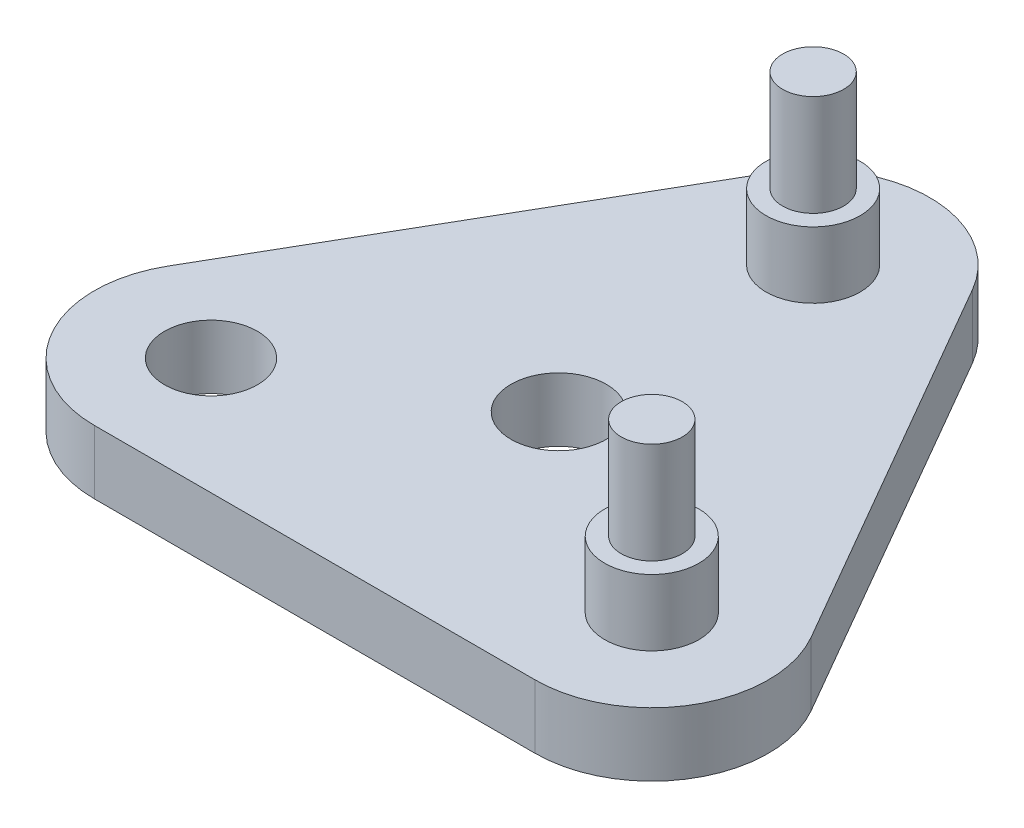
ISO-10303-21;
HEADER;
FILE_DESCRIPTION(('STEP AP214'),'2;1');
FILE_NAME('part.step','',(''),(''),'','','');
FILE_SCHEMA(('AUTOMOTIVE_DESIGN { 1 0 10303 214 1 1 1 1 }'));
ENDSEC;
DATA;
#1=APPLICATION_CONTEXT('core data for automotive mechanical design processes');
#2=APPLICATION_PROTOCOL_DEFINITION('international standard','automotive_design',2000,#1);
#3=PRODUCT_CONTEXT('',#1,'mechanical');
#4=PRODUCT('Part','Part','',(#3));
#5=PRODUCT_RELATED_PRODUCT_CATEGORY('part','',(#4));
#6=PRODUCT_DEFINITION_FORMATION('','',#4);
#7=PRODUCT_DEFINITION_CONTEXT('part definition',#1,'design');
#8=PRODUCT_DEFINITION('design','',#6,#7);
#9=PRODUCT_DEFINITION_SHAPE('','',#8);
#10=(LENGTH_UNIT() NAMED_UNIT(*) SI_UNIT(.MILLI.,.METRE.));
#11=(NAMED_UNIT(*) PLANE_ANGLE_UNIT() SI_UNIT($,.RADIAN.));
#12=(NAMED_UNIT(*) SI_UNIT($,.STERADIAN.) SOLID_ANGLE_UNIT());
#13=UNCERTAINTY_MEASURE_WITH_UNIT(LENGTH_MEASURE(1.E-05),#10,'distance_accuracy_value','');
#14=(GEOMETRIC_REPRESENTATION_CONTEXT(3) GLOBAL_UNCERTAINTY_ASSIGNED_CONTEXT((#13)) GLOBAL_UNIT_ASSIGNED_CONTEXT((#10,
#11,#12)) REPRESENTATION_CONTEXT('',''));
#15=CARTESIAN_POINT('',(0.,0.,0.));
#16=DIRECTION('',(0.,0.,1.));
#17=DIRECTION('',(1.,0.,0.));
#18=AXIS2_PLACEMENT_3D('',#15,#16,#17);
#19=CARTESIAN_POINT('',(-157.085204837098,-236.847084493501,-327.210425190433));
#20=DIRECTION('',(0.866025403784439,0.,0.5));
#21=DIRECTION('',(0.,-1.,0.));
#22=AXIS2_PLACEMENT_3D('',#19,#20,#21);
#23=PLANE('',#22);
#24=DIRECTION('',(-0.5,0.,0.866025403784439));
#25=VECTOR('',#24,1.);
#26=CARTESIAN_POINT('',(-135.088159580973,-243.197084493501,-365.310425190433));
#27=LINE('',#26,#25);
#28=CARTESIAN_POINT('',(-135.088159580973,-243.197084493501,-365.310425190433));
#29=VERTEX_POINT('',#28);
#30=CARTESIAN_POINT('',(-157.085204837098,-243.197084493501,-327.210425190433));
#31=VERTEX_POINT('',#30);
#32=EDGE_CURVE('E129',#29,#31,#27,.T.);
#33=ORIENTED_EDGE('',*,*,#32,.T.);
#34=DIRECTION('',(0.,-1.,0.));
#35=VECTOR('',#34,1.);
#36=CARTESIAN_POINT('',(-157.085204837098,-236.847084493501,-327.210425190433));
#37=LINE('',#36,#35);
#38=CARTESIAN_POINT('',(-157.085204837098,-236.847084493501,-327.210425190433));
#39=VERTEX_POINT('',#38);
#40=EDGE_CURVE('E164',#39,#31,#37,.T.);
#41=ORIENTED_EDGE('',*,*,#40,.F.);
#42=DIRECTION('',(-0.5,0.,0.866025403784439));
#43=VECTOR('',#42,1.);
#44=CARTESIAN_POINT('',(-135.088159580973,-236.847084493501,-365.310425190433));
#45=LINE('',#44,#43);
#46=CARTESIAN_POINT('',(-135.088159580973,-236.847084493501,-365.310425190433));
#47=VERTEX_POINT('',#46);
#48=EDGE_CURVE('E132',#47,#39,#45,.T.);
#49=ORIENTED_EDGE('',*,*,#48,.F.);
#50=DIRECTION('',(0.,-1.,0.));
#51=VECTOR('',#50,1.);
#52=CARTESIAN_POINT('',(-135.088159580973,-236.847084493501,-365.310425190433));
#53=LINE('',#52,#51);
#54=EDGE_CURVE('E12',#47,#29,#53,.T.);
#55=ORIENTED_EDGE('',*,*,#54,.T.);
#56=EDGE_LOOP('',(#33,#41,#49,#55));
#57=FACE_BOUND('',#56,.T.);
#58=ADVANCED_FACE('F65',(#57),#23,.F.);
#59=CARTESIAN_POINT('',(-125.00251433104,-236.847084493501,-359.487475190433));
#60=DIRECTION('',(0.,-1.,0.));
#61=DIRECTION('',(-1.,0.,0.));
#62=AXIS2_PLACEMENT_3D('',#59,#60,#61);
#63=CYLINDRICAL_SURFACE('',#62,11.6459);
#64=CARTESIAN_POINT('',(-125.00251433104,-243.197084493501,-359.487475190433));
#65=DIRECTION('',(0.,1.,0.));
#66=DIRECTION('',(1.,0.,0.));
#67=AXIS2_PLACEMENT_3D('',#64,#65,#66);
#68=CIRCLE('',#67,11.6459);
#69=CARTESIAN_POINT('',(-114.916869081106,-243.197084493501,-365.310425190433));
#70=VERTEX_POINT('',#69);
#71=EDGE_CURVE('E137',#70,#29,#68,.T.);
#72=ORIENTED_EDGE('',*,*,#71,.T.);
#73=ORIENTED_EDGE('',*,*,#54,.F.);
#74=CARTESIAN_POINT('',(-125.00251433104,-236.847084493501,-359.487475190433));
#75=DIRECTION('',(0.,1.,0.));
#76=DIRECTION('',(1.,0.,0.));
#77=AXIS2_PLACEMENT_3D('',#74,#75,#76);
#78=CIRCLE('',#77,11.6459);
#79=CARTESIAN_POINT('',(-114.916869081106,-236.847084493501,-365.310425190433));
#80=VERTEX_POINT('',#79);
#81=EDGE_CURVE('E188',#80,#47,#78,.T.);
#82=ORIENTED_EDGE('',*,*,#81,.F.);
#83=DIRECTION('',(0.,-1.,0.));
#84=VECTOR('',#83,1.);
#85=CARTESIAN_POINT('',(-114.916869081106,-236.847084493501,-365.310425190433));
#86=LINE('',#85,#84);
#87=EDGE_CURVE('E76',#80,#70,#86,.T.);
#88=ORIENTED_EDGE('',*,*,#87,.T.);
#89=EDGE_LOOP('',(#72,#73,#82,#88));
#90=FACE_BOUND('',#89,.T.);
#91=ADVANCED_FACE('F138',(#90),#63,.T.);
#92=CARTESIAN_POINT('',(-114.916869081106,-236.847084493501,-365.310425190433));
#93=DIRECTION('',(-0.866025403784438,0.,0.5));
#94=DIRECTION('',(-0.5,0.,-0.866025403784438));
#95=AXIS2_PLACEMENT_3D('',#92,#93,#94);
#96=PLANE('',#95);
#97=DIRECTION('',(-0.5,0.,-0.866025403784438));
#98=VECTOR('',#97,1.);
#99=CARTESIAN_POINT('',(-92.9198238249817,-243.197084493501,-327.210425190433));
#100=LINE('',#99,#98);
#101=CARTESIAN_POINT('',(-92.9198238249817,-243.197084493501,-327.210425190433));
#102=VERTEX_POINT('',#101);
#103=EDGE_CURVE('E143',#102,#70,#100,.T.);
#104=ORIENTED_EDGE('',*,*,#103,.T.);
#105=ORIENTED_EDGE('',*,*,#87,.F.);
#106=DIRECTION('',(-0.5,0.,-0.866025403784438));
#107=VECTOR('',#106,1.);
#108=CARTESIAN_POINT('',(-92.9198238249817,-236.847084493501,-327.210425190433));
#109=LINE('',#108,#107);
#110=CARTESIAN_POINT('',(-92.9198238249817,-236.847084493501,-327.210425190433));
#111=VERTEX_POINT('',#110);
#112=EDGE_CURVE('E186',#111,#80,#109,.T.);
#113=ORIENTED_EDGE('',*,*,#112,.F.);
#114=DIRECTION('',(0.,-1.,0.));
#115=VECTOR('',#114,1.);
#116=CARTESIAN_POINT('',(-92.9198238249817,-236.847084493501,-327.210425190433));
#117=LINE('',#116,#115);
#118=EDGE_CURVE('E171',#111,#102,#117,.T.);
#119=ORIENTED_EDGE('',*,*,#118,.T.);
#120=EDGE_LOOP('',(#104,#105,#113,#119));
#121=FACE_BOUND('',#120,.T.);
#122=ADVANCED_FACE('F67',(#121),#96,.F.);
#123=CARTESIAN_POINT('',(-103.005469074915,-236.847084493501,-321.387475190433));
#124=DIRECTION('',(0.,-1.,0.));
#125=DIRECTION('',(0.866025403784439,0.,0.5));
#126=AXIS2_PLACEMENT_3D('',#123,#124,#125);
#127=CYLINDRICAL_SURFACE('',#126,11.6459);
#128=CARTESIAN_POINT('',(-103.005469074915,-243.197084493501,-321.387475190433));
#129=DIRECTION('',(0.,1.,0.));
#130=DIRECTION('',(1.,0.,0.));
#131=AXIS2_PLACEMENT_3D('',#128,#129,#130);
#132=CIRCLE('',#131,11.6459);
#133=CARTESIAN_POINT('',(-103.005469074915,-243.197084493501,-309.741575190433));
#134=VERTEX_POINT('',#133);
#135=EDGE_CURVE('E158',#134,#102,#132,.T.);
#136=ORIENTED_EDGE('',*,*,#135,.T.);
#137=ORIENTED_EDGE('',*,*,#118,.F.);
#138=CARTESIAN_POINT('',(-103.005469074915,-236.847084493501,-321.387475190433));
#139=DIRECTION('',(0.,1.,0.));
#140=DIRECTION('',(1.,0.,0.));
#141=AXIS2_PLACEMENT_3D('',#138,#139,#140);
#142=CIRCLE('',#141,11.6459);
#143=CARTESIAN_POINT('',(-103.005469074915,-236.847084493501,-309.741575190433));
#144=VERTEX_POINT('',#143);
#145=EDGE_CURVE('E184',#144,#111,#142,.T.);
#146=ORIENTED_EDGE('',*,*,#145,.F.);
#147=DIRECTION('',(0.,-1.,0.));
#148=VECTOR('',#147,1.);
#149=CARTESIAN_POINT('',(-103.005469074915,-236.847084493501,-309.741575190433));
#150=LINE('',#149,#148);
#151=EDGE_CURVE('E88',#144,#134,#150,.T.);
#152=ORIENTED_EDGE('',*,*,#151,.T.);
#153=EDGE_LOOP('',(#136,#137,#146,#152));
#154=FACE_BOUND('',#153,.T.);
#155=ADVANCED_FACE('F273',(#154),#127,.T.);
#156=CARTESIAN_POINT('',(-146.999559587164,-236.847084493501,-309.741575190433));
#157=DIRECTION('',(0.,0.,-1.));
#158=DIRECTION('',(1.,0.,0.));
#159=AXIS2_PLACEMENT_3D('',#156,#157,#158);
#160=PLANE('',#159);
#161=DIRECTION('',(1.,0.,0.));
#162=VECTOR('',#161,1.);
#163=CARTESIAN_POINT('',(-146.999559587164,-243.197084493501,-309.741575190433));
#164=LINE('',#163,#162);
#165=CARTESIAN_POINT('',(-146.999559587164,-243.197084493501,-309.741575190433));
#166=VERTEX_POINT('',#165);
#167=EDGE_CURVE('E161',#166,#134,#164,.T.);
#168=ORIENTED_EDGE('',*,*,#167,.T.);
#169=ORIENTED_EDGE('',*,*,#151,.F.);
#170=DIRECTION('',(1.,0.,0.));
#171=VECTOR('',#170,1.);
#172=CARTESIAN_POINT('',(-146.999559587164,-236.847084493501,-309.741575190433));
#173=LINE('',#172,#171);
#174=CARTESIAN_POINT('',(-146.999559587164,-236.847084493501,-309.741575190433));
#175=VERTEX_POINT('',#174);
#176=EDGE_CURVE('E198',#175,#144,#173,.T.);
#177=ORIENTED_EDGE('',*,*,#176,.F.);
#178=DIRECTION('',(0.,-1.,0.));
#179=VECTOR('',#178,1.);
#180=CARTESIAN_POINT('',(-146.999559587164,-236.847084493501,-309.741575190433));
#181=LINE('',#180,#179);
#182=EDGE_CURVE('E119',#175,#166,#181,.T.);
#183=ORIENTED_EDGE('',*,*,#182,.T.);
#184=EDGE_LOOP('',(#168,#169,#177,#183));
#185=FACE_BOUND('',#184,.T.);
#186=ADVANCED_FACE('F275',(#185),#160,.F.);
#187=CARTESIAN_POINT('',(-146.999559587164,-236.847084493501,-321.387475190433));
#188=DIRECTION('',(0.,-1.,0.));
#189=DIRECTION('',(-1.,0.,0.));
#190=AXIS2_PLACEMENT_3D('',#187,#188,#189);
#191=CYLINDRICAL_SURFACE('',#190,11.6459);
#192=CARTESIAN_POINT('',(-146.999559587164,-243.197084493501,-321.387475190433));
#193=DIRECTION('',(0.,1.,0.));
#194=DIRECTION('',(1.,0.,0.));
#195=AXIS2_PLACEMENT_3D('',#192,#193,#194);
#196=CIRCLE('',#195,11.6459);
#197=EDGE_CURVE('E147',#31,#166,#196,.T.);
#198=ORIENTED_EDGE('',*,*,#197,.T.);
#199=ORIENTED_EDGE('',*,*,#182,.F.);
#200=CARTESIAN_POINT('',(-146.999559587164,-236.847084493501,-321.387475190433));
#201=DIRECTION('',(0.,1.,0.));
#202=DIRECTION('',(1.,0.,0.));
#203=AXIS2_PLACEMENT_3D('',#200,#201,#202);
#204=CIRCLE('',#203,11.6459);
#205=EDGE_CURVE('E202',#39,#175,#204,.T.);
#206=ORIENTED_EDGE('',*,*,#205,.F.);
#207=ORIENTED_EDGE('',*,*,#40,.T.);
#208=EDGE_LOOP('',(#198,#199,#206,#207));
#209=FACE_BOUND('',#208,.T.);
#210=ADVANCED_FACE('F277',(#209),#191,.T.);
#211=CARTESIAN_POINT('',(-146.999559587164,-243.197084493501,-321.387475190433));
#212=DIRECTION('',(0.,1.,0.));
#213=DIRECTION('',(1.,0.,0.));
#214=AXIS2_PLACEMENT_3D('',#211,#212,#213);
#215=PLANE('',#214);
#216=CARTESIAN_POINT('',(-146.999559587164,-243.197084493501,-321.387475190433));
#217=DIRECTION('',(0.,1.,0.));
#218=DIRECTION('',(-1.,0.,0.));
#219=AXIS2_PLACEMENT_3D('',#216,#217,#218);
#220=CIRCLE('',#219,4.6355);
#221=CARTESIAN_POINT('',(-151.635059587164,-243.197084493501,-321.387475190433));
#222=VERTEX_POINT('',#221);
#223=EDGE_CURVE('E204',#222,#222,#220,.T.);
#224=ORIENTED_EDGE('',*,*,#223,.T.);
#225=EDGE_LOOP('',(#224));
#226=FACE_BOUND('',#225,.T.);
#227=CARTESIAN_POINT('',(-125.00251433104,-243.197084493501,-334.087475190433));
#228=DIRECTION('',(0.,1.,0.));
#229=DIRECTION('',(-1.,0.,0.));
#230=AXIS2_PLACEMENT_3D('',#227,#228,#229);
#231=CIRCLE('',#230,4.7625);
#232=CARTESIAN_POINT('',(-129.76501433104,-243.197084493501,-334.087475190433));
#233=VERTEX_POINT('',#232);
#234=EDGE_CURVE('E212',#233,#233,#231,.T.);
#235=ORIENTED_EDGE('',*,*,#234,.T.);
#236=EDGE_LOOP('',(#235));
#237=FACE_BOUND('',#236,.T.);
#238=ORIENTED_EDGE('',*,*,#197,.F.);
#239=ORIENTED_EDGE('',*,*,#32,.F.);
#240=ORIENTED_EDGE('',*,*,#71,.F.);
#241=ORIENTED_EDGE('',*,*,#103,.F.);
#242=ORIENTED_EDGE('',*,*,#135,.F.);
#243=ORIENTED_EDGE('',*,*,#167,.F.);
#244=EDGE_LOOP('',(#238,#239,#240,#241,#242,#243));
#245=FACE_BOUND('',#244,.T.);
#246=ADVANCED_FACE('F145',(#226,#237,#245),#215,.F.);
#247=CARTESIAN_POINT('',(-146.999559587164,-236.847084493501,-321.387475190433));
#248=DIRECTION('',(0.,1.,0.));
#249=DIRECTION('',(1.,0.,0.));
#250=AXIS2_PLACEMENT_3D('',#247,#248,#249);
#251=PLANE('',#250);
#252=CARTESIAN_POINT('',(-125.00251433104,-236.847084493501,-359.487475190433));
#253=DIRECTION('',(0.,1.,0.));
#254=DIRECTION('',(-1.,0.,0.));
#255=AXIS2_PLACEMENT_3D('',#252,#253,#254);
#256=CIRCLE('',#255,4.699);
#257=CARTESIAN_POINT('',(-120.30351433104,-236.847084493501,-359.487475190433));
#258=VERTEX_POINT('',#257);
#259=EDGE_CURVE('E224',#258,#258,#256,.T.);
#260=ORIENTED_EDGE('',*,*,#259,.F.);
#261=EDGE_LOOP('',(#260));
#262=FACE_BOUND('',#261,.T.);
#263=CARTESIAN_POINT('',(-103.005469074915,-236.847084493501,-321.387475190433));
#264=DIRECTION('',(0.,1.,0.));
#265=DIRECTION('',(-1.,0.,0.));
#266=AXIS2_PLACEMENT_3D('',#263,#264,#265);
#267=CIRCLE('',#266,4.699);
#268=CARTESIAN_POINT('',(-98.3064690749149,-236.847084493501,-321.387475190433));
#269=VERTEX_POINT('',#268);
#270=EDGE_CURVE('E219',#269,#269,#267,.T.);
#271=ORIENTED_EDGE('',*,*,#270,.F.);
#272=EDGE_LOOP('',(#271));
#273=FACE_BOUND('',#272,.T.);
#274=CARTESIAN_POINT('',(-125.00251433104,-236.847084493501,-334.087475190433));
#275=DIRECTION('',(0.,1.,0.));
#276=DIRECTION('',(-1.,0.,0.));
#277=AXIS2_PLACEMENT_3D('',#274,#275,#276);
#278=CIRCLE('',#277,4.7625);
#279=CARTESIAN_POINT('',(-129.76501433104,-236.847084493501,-334.087475190433));
#280=VERTEX_POINT('',#279);
#281=EDGE_CURVE('E69',#280,#280,#278,.T.);
#282=ORIENTED_EDGE('',*,*,#281,.F.);
#283=EDGE_LOOP('',(#282));
#284=FACE_BOUND('',#283,.T.);
#285=CARTESIAN_POINT('',(-146.999559587164,-236.847084493501,-321.387475190433));
#286=DIRECTION('',(0.,1.,0.));
#287=DIRECTION('',(-1.,0.,0.));
#288=AXIS2_PLACEMENT_3D('',#285,#286,#287);
#289=CIRCLE('',#288,4.6355);
#290=CARTESIAN_POINT('',(-151.635059587164,-236.847084493501,-321.387475190433));
#291=VERTEX_POINT('',#290);
#292=EDGE_CURVE('E208',#291,#291,#289,.T.);
#293=ORIENTED_EDGE('',*,*,#292,.F.);
#294=EDGE_LOOP('',(#293));
#295=FACE_BOUND('',#294,.T.);
#296=ORIENTED_EDGE('',*,*,#205,.T.);
#297=ORIENTED_EDGE('',*,*,#176,.T.);
#298=ORIENTED_EDGE('',*,*,#145,.T.);
#299=ORIENTED_EDGE('',*,*,#112,.T.);
#300=ORIENTED_EDGE('',*,*,#81,.T.);
#301=ORIENTED_EDGE('',*,*,#48,.T.);
#302=EDGE_LOOP('',(#296,#297,#298,#299,#300,#301));
#303=FACE_BOUND('',#302,.T.);
#304=ADVANCED_FACE('F283',(#262,#273,#284,#295,#303),#251,.T.);
#305=CARTESIAN_POINT('',(-125.00251433104,-249.547084493501,-334.087475190433));
#306=DIRECTION('',(0.,1.,0.));
#307=DIRECTION('',(-1.,0.,0.));
#308=AXIS2_PLACEMENT_3D('',#305,#306,#307);
#309=CYLINDRICAL_SURFACE('',#308,4.7625);
#310=ORIENTED_EDGE('',*,*,#281,.T.);
#311=EDGE_LOOP('',(#310));
#312=FACE_BOUND('',#311,.T.);
#313=ORIENTED_EDGE('',*,*,#234,.F.);
#314=EDGE_LOOP('',(#313));
#315=FACE_BOUND('',#314,.T.);
#316=ADVANCED_FACE('F288',(#312,#315),#309,.F.);
#317=CARTESIAN_POINT('',(-146.999559587164,-249.547084493501,-321.387475190433));
#318=DIRECTION('',(0.,1.,0.));
#319=DIRECTION('',(-1.,0.,0.));
#320=AXIS2_PLACEMENT_3D('',#317,#318,#319);
#321=CYLINDRICAL_SURFACE('',#320,4.6355);
#322=ORIENTED_EDGE('',*,*,#292,.T.);
#323=EDGE_LOOP('',(#322));
#324=FACE_BOUND('',#323,.T.);
#325=ORIENTED_EDGE('',*,*,#223,.F.);
#326=EDGE_LOOP('',(#325));
#327=FACE_BOUND('',#326,.T.);
#328=ADVANCED_FACE('F292',(#324,#327),#321,.F.);
#329=CARTESIAN_POINT('',(-125.00251433104,-230.243084493501,-359.487475190433));
#330=DIRECTION('',(0.,-1.,0.));
#331=DIRECTION('',(1.,0.,0.));
#332=AXIS2_PLACEMENT_3D('',#329,#330,#331);
#333=CYLINDRICAL_SURFACE('',#332,4.699);
#334=CARTESIAN_POINT('',(-125.00251433104,-230.243084493501,-359.487475190433));
#335=DIRECTION('',(0.,1.,0.));
#336=DIRECTION('',(-1.,0.,0.));
#337=AXIS2_PLACEMENT_3D('',#334,#335,#336);
#338=CIRCLE('',#337,4.699);
#339=CARTESIAN_POINT('',(-120.30351433104,-230.243084493501,-359.487475190433));
#340=VERTEX_POINT('',#339);
#341=EDGE_CURVE('E228',#340,#340,#338,.T.);
#342=CARTESIAN_POINT('',(-120.30351433104,-230.243084493501,-359.487475190433));
#343=CARTESIAN_POINT('',(-120.30351433104,-230.311876160168,-359.487475190433));
#344=CARTESIAN_POINT('',(-120.30351433104,-230.380667826834,-359.487475190433));
#345=CARTESIAN_POINT('',(-120.30351433104,-230.518251160168,-359.487475190433));
#346=CARTESIAN_POINT('',(-120.30351433104,-230.587042826834,-359.487475190433));
#347=CARTESIAN_POINT('',(-120.30351433104,-230.724626160168,-359.487475190433));
#348=CARTESIAN_POINT('',(-120.30351433104,-230.793417826834,-359.487475190433));
#349=CARTESIAN_POINT('',(-120.30351433104,-230.931001160168,-359.487475190433));
#350=CARTESIAN_POINT('',(-120.30351433104,-230.999792826834,-359.487475190433));
#351=CARTESIAN_POINT('',(-120.30351433104,-231.137376160168,-359.487475190433));
#352=CARTESIAN_POINT('',(-120.30351433104,-231.206167826834,-359.487475190433));
#353=CARTESIAN_POINT('',(-120.30351433104,-231.343751160168,-359.487475190433));
#354=CARTESIAN_POINT('',(-120.30351433104,-231.412542826834,-359.487475190433));
#355=CARTESIAN_POINT('',(-120.30351433104,-231.550126160168,-359.487475190433));
#356=CARTESIAN_POINT('',(-120.30351433104,-231.618917826834,-359.487475190433));
#357=CARTESIAN_POINT('',(-120.30351433104,-231.756501160168,-359.487475190433));
#358=CARTESIAN_POINT('',(-120.30351433104,-231.825292826834,-359.487475190433));
#359=CARTESIAN_POINT('',(-120.30351433104,-231.962876160168,-359.487475190433));
#360=CARTESIAN_POINT('',(-120.30351433104,-232.031667826834,-359.487475190433));
#361=CARTESIAN_POINT('',(-120.30351433104,-232.169251160168,-359.487475190433));
#362=CARTESIAN_POINT('',(-120.30351433104,-232.238042826834,-359.487475190433));
#363=CARTESIAN_POINT('',(-120.30351433104,-232.375626160168,-359.487475190433));
#364=CARTESIAN_POINT('',(-120.30351433104,-232.444417826834,-359.487475190433));
#365=CARTESIAN_POINT('',(-120.30351433104,-232.582001160168,-359.487475190433));
#366=CARTESIAN_POINT('',(-120.30351433104,-232.650792826834,-359.487475190433));
#367=CARTESIAN_POINT('',(-120.30351433104,-232.788376160168,-359.487475190433));
#368=CARTESIAN_POINT('',(-120.30351433104,-232.857167826834,-359.487475190433));
#369=CARTESIAN_POINT('',(-120.30351433104,-232.994751160168,-359.487475190433));
#370=CARTESIAN_POINT('',(-120.30351433104,-233.063542826834,-359.487475190433));
#371=CARTESIAN_POINT('',(-120.30351433104,-233.201126160168,-359.487475190433));
#372=CARTESIAN_POINT('',(-120.30351433104,-233.269917826834,-359.487475190433));
#373=CARTESIAN_POINT('',(-120.30351433104,-233.407501160168,-359.487475190433));
#374=CARTESIAN_POINT('',(-120.30351433104,-233.476292826834,-359.487475190433));
#375=CARTESIAN_POINT('',(-120.30351433104,-233.613876160168,-359.487475190433));
#376=CARTESIAN_POINT('',(-120.30351433104,-233.682667826834,-359.487475190433));
#377=CARTESIAN_POINT('',(-120.30351433104,-233.820251160168,-359.487475190433));
#378=CARTESIAN_POINT('',(-120.30351433104,-233.889042826834,-359.487475190433));
#379=CARTESIAN_POINT('',(-120.30351433104,-234.026626160168,-359.487475190433));
#380=CARTESIAN_POINT('',(-120.30351433104,-234.095417826834,-359.487475190433));
#381=CARTESIAN_POINT('',(-120.30351433104,-234.233001160168,-359.487475190433));
#382=CARTESIAN_POINT('',(-120.30351433104,-234.301792826834,-359.487475190433));
#383=CARTESIAN_POINT('',(-120.30351433104,-234.439376160168,-359.487475190433));
#384=CARTESIAN_POINT('',(-120.30351433104,-234.508167826834,-359.487475190433));
#385=CARTESIAN_POINT('',(-120.30351433104,-234.645751160168,-359.487475190433));
#386=CARTESIAN_POINT('',(-120.30351433104,-234.714542826834,-359.487475190433));
#387=CARTESIAN_POINT('',(-120.30351433104,-234.852126160168,-359.487475190433));
#388=CARTESIAN_POINT('',(-120.30351433104,-234.920917826834,-359.487475190433));
#389=CARTESIAN_POINT('',(-120.30351433104,-235.058501160168,-359.487475190433));
#390=CARTESIAN_POINT('',(-120.30351433104,-235.127292826834,-359.487475190433));
#391=CARTESIAN_POINT('',(-120.30351433104,-235.264876160168,-359.487475190433));
#392=CARTESIAN_POINT('',(-120.30351433104,-235.333667826834,-359.487475190433));
#393=CARTESIAN_POINT('',(-120.30351433104,-235.471251160168,-359.487475190433));
#394=CARTESIAN_POINT('',(-120.30351433104,-235.540042826834,-359.487475190433));
#395=CARTESIAN_POINT('',(-120.30351433104,-235.677626160168,-359.487475190433));
#396=CARTESIAN_POINT('',(-120.30351433104,-235.746417826834,-359.487475190433));
#397=CARTESIAN_POINT('',(-120.30351433104,-235.884001160168,-359.487475190433));
#398=CARTESIAN_POINT('',(-120.30351433104,-235.952792826834,-359.487475190433));
#399=CARTESIAN_POINT('',(-120.30351433104,-236.090376160168,-359.487475190433));
#400=CARTESIAN_POINT('',(-120.30351433104,-236.159167826834,-359.487475190433));
#401=CARTESIAN_POINT('',(-120.30351433104,-236.296751160168,-359.487475190433));
#402=CARTESIAN_POINT('',(-120.30351433104,-236.365542826834,-359.487475190433));
#403=CARTESIAN_POINT('',(-120.30351433104,-236.503126160168,-359.487475190433));
#404=CARTESIAN_POINT('',(-120.30351433104,-236.571917826834,-359.487475190433));
#405=CARTESIAN_POINT('',(-120.30351433104,-236.709501160168,-359.487475190433));
#406=CARTESIAN_POINT('',(-120.30351433104,-236.778292826834,-359.487475190433));
#407=CARTESIAN_POINT('',(-120.30351433104,-236.847084493501,-359.487475190433));
#408=B_SPLINE_CURVE_WITH_KNOTS('',3,(#342,#343,#344,#345,#346,#347,#348,#349,#350,#351,#352,
#353,#354,#355,#356,#357,#358,#359,#360,#361,#362,#363,#364,#365,#366,#367,#368,#369,#370,#371,
#372,#373,#374,#375,#376,#377,#378,#379,#380,#381,#382,#383,#384,#385,#386,#387,#388,#389,#390,
#391,#392,#393,#394,#395,#396,#397,#398,#399,#400,#401,#402,#403,#404,#405,#406,#407),
.UNSPECIFIED.,.F.,.F.,(4,2,2,2,2,2,2,2,2,2,2,2,2,2,2,2,2,2,2,2,2,2,2,2,2,2,2,2,2,2,2,2,4),(0.,
0.206375000000009,0.412750000000017,0.619125000000026,0.825500000000007,1.03187500000002,
1.23825000000002,1.444625,1.65100000000001,1.85737500000002,2.06375,2.27012500000001,
2.47650000000002,2.682875,2.88925000000001,3.09562500000002,3.302,3.50837500000001,
3.71475000000002,3.92112500000003,4.12750000000001,4.33387500000002,4.54025000000002,4.746625,
4.95300000000001,5.15937500000002,5.36575,5.57212500000001,5.77850000000002,5.984875,
6.19125000000001,6.39762500000002,6.604),.UNSPECIFIED.);
#409=EDGE_CURVE('BSEAM294',#340,#258,#408,.T.);
#410=ORIENTED_EDGE('',*,*,#341,.F.);
#411=ORIENTED_EDGE('',*,*,#259,.T.);
#412=ORIENTED_EDGE('',*,*,#409,.T.);
#413=ORIENTED_EDGE('',*,*,#409,.F.);
#414=EDGE_LOOP('',(#410,#412,#411,#413));
#415=FACE_BOUND('',#414,.T.);
#416=ADVANCED_FACE('F294',(#415),#333,.T.);
#417=CARTESIAN_POINT('',(-125.00251433104,-230.243084493501,-359.487475190433));
#418=DIRECTION('',(0.,1.,0.));
#419=DIRECTION('',(-1.,0.,0.));
#420=AXIS2_PLACEMENT_3D('',#417,#418,#419);
#421=PLANE('',#420);
#422=ORIENTED_EDGE('',*,*,#341,.T.);
#423=EDGE_LOOP('',(#422));
#424=FACE_BOUND('',#423,.T.);
#425=CARTESIAN_POINT('',(-125.00251433104,-230.243084493501,-359.487475190433));
#426=DIRECTION('',(0.,1.,0.));
#427=DIRECTION('',(-1.,0.,0.));
#428=AXIS2_PLACEMENT_3D('',#425,#426,#427);
#429=CIRCLE('',#428,3.048);
#430=CARTESIAN_POINT('',(-128.05051433104,-230.243084493501,-359.487475190433));
#431=VERTEX_POINT('',#430);
#432=EDGE_CURVE('E237',#431,#431,#429,.F.);
#433=ORIENTED_EDGE('',*,*,#432,.T.);
#434=EDGE_LOOP('',(#433));
#435=FACE_BOUND('',#434,.T.);
#436=ADVANCED_FACE('F302',(#424,#435),#421,.T.);
#437=CARTESIAN_POINT('',(-103.005469074915,-230.243084493501,-321.387475190433));
#438=DIRECTION('',(0.,-1.,0.));
#439=DIRECTION('',(1.,0.,0.));
#440=AXIS2_PLACEMENT_3D('',#437,#438,#439);
#441=CYLINDRICAL_SURFACE('',#440,4.699);
#442=CARTESIAN_POINT('',(-103.005469074915,-230.243084493501,-321.387475190433));
#443=DIRECTION('',(0.,1.,0.));
#444=DIRECTION('',(-1.,0.,0.));
#445=AXIS2_PLACEMENT_3D('',#442,#443,#444);
#446=CIRCLE('',#445,4.699);
#447=CARTESIAN_POINT('',(-98.3064690749149,-230.243084493501,-321.387475190433));
#448=VERTEX_POINT('',#447);
#449=EDGE_CURVE('E216',#448,#448,#446,.T.);
#450=CARTESIAN_POINT('',(-98.3064690749149,-230.243084493501,-321.387475190433));
#451=CARTESIAN_POINT('',(-98.3064690749149,-230.311876160168,-321.387475190433));
#452=CARTESIAN_POINT('',(-98.3064690749149,-230.380667826834,-321.387475190433));
#453=CARTESIAN_POINT('',(-98.3064690749149,-230.518251160168,-321.387475190433));
#454=CARTESIAN_POINT('',(-98.3064690749149,-230.587042826834,-321.387475190433));
#455=CARTESIAN_POINT('',(-98.3064690749149,-230.724626160168,-321.387475190433));
#456=CARTESIAN_POINT('',(-98.3064690749149,-230.793417826834,-321.387475190433));
#457=CARTESIAN_POINT('',(-98.3064690749149,-230.931001160168,-321.387475190433));
#458=CARTESIAN_POINT('',(-98.3064690749149,-230.999792826834,-321.387475190433));
#459=CARTESIAN_POINT('',(-98.3064690749149,-231.137376160168,-321.387475190433));
#460=CARTESIAN_POINT('',(-98.3064690749149,-231.206167826834,-321.387475190433));
#461=CARTESIAN_POINT('',(-98.3064690749149,-231.343751160168,-321.387475190433));
#462=CARTESIAN_POINT('',(-98.3064690749149,-231.412542826834,-321.387475190433));
#463=CARTESIAN_POINT('',(-98.3064690749149,-231.550126160168,-321.387475190433));
#464=CARTESIAN_POINT('',(-98.3064690749149,-231.618917826834,-321.387475190433));
#465=CARTESIAN_POINT('',(-98.3064690749149,-231.756501160168,-321.387475190433));
#466=CARTESIAN_POINT('',(-98.3064690749149,-231.825292826834,-321.387475190433));
#467=CARTESIAN_POINT('',(-98.3064690749149,-231.962876160168,-321.387475190433));
#468=CARTESIAN_POINT('',(-98.3064690749149,-232.031667826834,-321.387475190433));
#469=CARTESIAN_POINT('',(-98.3064690749149,-232.169251160168,-321.387475190433));
#470=CARTESIAN_POINT('',(-98.3064690749149,-232.238042826834,-321.387475190433));
#471=CARTESIAN_POINT('',(-98.3064690749149,-232.375626160168,-321.387475190433));
#472=CARTESIAN_POINT('',(-98.3064690749149,-232.444417826834,-321.387475190433));
#473=CARTESIAN_POINT('',(-98.3064690749149,-232.582001160168,-321.387475190433));
#474=CARTESIAN_POINT('',(-98.3064690749149,-232.650792826834,-321.387475190433));
#475=CARTESIAN_POINT('',(-98.3064690749149,-232.788376160168,-321.387475190433));
#476=CARTESIAN_POINT('',(-98.3064690749149,-232.857167826834,-321.387475190433));
#477=CARTESIAN_POINT('',(-98.3064690749149,-232.994751160168,-321.387475190433));
#478=CARTESIAN_POINT('',(-98.3064690749149,-233.063542826834,-321.387475190433));
#479=CARTESIAN_POINT('',(-98.3064690749149,-233.201126160168,-321.387475190433));
#480=CARTESIAN_POINT('',(-98.3064690749149,-233.269917826834,-321.387475190433));
#481=CARTESIAN_POINT('',(-98.3064690749149,-233.407501160168,-321.387475190433));
#482=CARTESIAN_POINT('',(-98.3064690749149,-233.476292826834,-321.387475190433));
#483=CARTESIAN_POINT('',(-98.3064690749149,-233.613876160168,-321.387475190433));
#484=CARTESIAN_POINT('',(-98.3064690749149,-233.682667826834,-321.387475190433));
#485=CARTESIAN_POINT('',(-98.3064690749149,-233.820251160168,-321.387475190433));
#486=CARTESIAN_POINT('',(-98.3064690749149,-233.889042826834,-321.387475190433));
#487=CARTESIAN_POINT('',(-98.3064690749149,-234.026626160168,-321.387475190433));
#488=CARTESIAN_POINT('',(-98.3064690749149,-234.095417826834,-321.387475190433));
#489=CARTESIAN_POINT('',(-98.3064690749149,-234.233001160168,-321.387475190433));
#490=CARTESIAN_POINT('',(-98.3064690749149,-234.301792826834,-321.387475190433));
#491=CARTESIAN_POINT('',(-98.3064690749149,-234.439376160168,-321.387475190433));
#492=CARTESIAN_POINT('',(-98.3064690749149,-234.508167826834,-321.387475190433));
#493=CARTESIAN_POINT('',(-98.3064690749149,-234.645751160168,-321.387475190433));
#494=CARTESIAN_POINT('',(-98.3064690749149,-234.714542826834,-321.387475190433));
#495=CARTESIAN_POINT('',(-98.3064690749149,-234.852126160168,-321.387475190433));
#496=CARTESIAN_POINT('',(-98.3064690749149,-234.920917826834,-321.387475190433));
#497=CARTESIAN_POINT('',(-98.3064690749149,-235.058501160168,-321.387475190433));
#498=CARTESIAN_POINT('',(-98.3064690749149,-235.127292826834,-321.387475190433));
#499=CARTESIAN_POINT('',(-98.3064690749149,-235.264876160168,-321.387475190433));
#500=CARTESIAN_POINT('',(-98.3064690749149,-235.333667826834,-321.387475190433));
#501=CARTESIAN_POINT('',(-98.3064690749149,-235.471251160168,-321.387475190433));
#502=CARTESIAN_POINT('',(-98.3064690749149,-235.540042826834,-321.387475190433));
#503=CARTESIAN_POINT('',(-98.3064690749149,-235.677626160168,-321.387475190433));
#504=CARTESIAN_POINT('',(-98.3064690749149,-235.746417826834,-321.387475190433));
#505=CARTESIAN_POINT('',(-98.3064690749149,-235.884001160168,-321.387475190433));
#506=CARTESIAN_POINT('',(-98.3064690749149,-235.952792826834,-321.387475190433));
#507=CARTESIAN_POINT('',(-98.3064690749149,-236.090376160168,-321.387475190433));
#508=CARTESIAN_POINT('',(-98.3064690749149,-236.159167826834,-321.387475190433));
#509=CARTESIAN_POINT('',(-98.3064690749149,-236.296751160168,-321.387475190433));
#510=CARTESIAN_POINT('',(-98.3064690749149,-236.365542826834,-321.387475190433));
#511=CARTESIAN_POINT('',(-98.3064690749149,-236.503126160168,-321.387475190433));
#512=CARTESIAN_POINT('',(-98.3064690749149,-236.571917826834,-321.387475190433));
#513=CARTESIAN_POINT('',(-98.3064690749149,-236.709501160168,-321.387475190433));
#514=CARTESIAN_POINT('',(-98.3064690749149,-236.778292826834,-321.387475190433));
#515=CARTESIAN_POINT('',(-98.3064690749149,-236.847084493501,-321.387475190433));
#516=B_SPLINE_CURVE_WITH_KNOTS('',3,(#450,#451,#452,#453,#454,#455,#456,#457,#458,#459,#460,
#461,#462,#463,#464,#465,#466,#467,#468,#469,#470,#471,#472,#473,#474,#475,#476,#477,#478,#479,
#480,#481,#482,#483,#484,#485,#486,#487,#488,#489,#490,#491,#492,#493,#494,#495,#496,#497,#498,
#499,#500,#501,#502,#503,#504,#505,#506,#507,#508,#509,#510,#511,#512,#513,#514,#515),
.UNSPECIFIED.,.F.,.F.,(4,2,2,2,2,2,2,2,2,2,2,2,2,2,2,2,2,2,2,2,2,2,2,2,2,2,2,2,2,2,2,2,4),(0.,
0.206375000000009,0.412750000000017,0.619125000000026,0.825500000000007,1.03187500000002,
1.23825000000002,1.444625,1.65100000000001,1.85737500000002,2.06375,2.27012500000001,
2.47650000000002,2.682875,2.88925000000001,3.09562500000002,3.302,3.50837500000001,
3.71475000000002,3.92112500000003,4.12750000000001,4.33387500000002,4.54025000000002,4.746625,
4.95300000000001,5.15937500000002,5.36575,5.57212500000001,5.77850000000002,5.984875,
6.19125000000001,6.39762500000002,6.604),.UNSPECIFIED.);
#517=EDGE_CURVE('BSEAM262',#448,#269,#516,.T.);
#518=ORIENTED_EDGE('',*,*,#449,.F.);
#519=ORIENTED_EDGE('',*,*,#270,.T.);
#520=ORIENTED_EDGE('',*,*,#517,.T.);
#521=ORIENTED_EDGE('',*,*,#517,.F.);
#522=EDGE_LOOP('',(#518,#520,#519,#521));
#523=FACE_BOUND('',#522,.T.);
#524=ADVANCED_FACE('F262',(#523),#441,.T.);
#525=CARTESIAN_POINT('',(-103.005469074915,-230.243084493501,-321.387475190433));
#526=DIRECTION('',(0.,1.,0.));
#527=DIRECTION('',(-1.,0.,0.));
#528=AXIS2_PLACEMENT_3D('',#525,#526,#527);
#529=PLANE('',#528);
#530=ORIENTED_EDGE('',*,*,#449,.T.);
#531=EDGE_LOOP('',(#530));
#532=FACE_BOUND('',#531,.T.);
#533=CARTESIAN_POINT('',(-103.005469074915,-230.243084493501,-321.387475190433));
#534=DIRECTION('',(0.,1.,0.));
#535=DIRECTION('',(-1.,0.,0.));
#536=AXIS2_PLACEMENT_3D('',#533,#534,#535);
#537=CIRCLE('',#536,3.048);
#538=CARTESIAN_POINT('',(-106.053469074915,-230.243084493501,-321.387475190433));
#539=VERTEX_POINT('',#538);
#540=EDGE_CURVE('E236',#539,#539,#537,.F.);
#541=ORIENTED_EDGE('',*,*,#540,.T.);
#542=EDGE_LOOP('',(#541));
#543=FACE_BOUND('',#542,.T.);
#544=ADVANCED_FACE('F252',(#532,#543),#529,.T.);
#545=CARTESIAN_POINT('',(-103.005469074915,-249.34552992231,-321.387475190433));
#546=DIRECTION('',(0.,1.,0.));
#547=DIRECTION('',(-1.,0.,0.));
#548=AXIS2_PLACEMENT_3D('',#545,#546,#547);
#549=CYLINDRICAL_SURFACE('',#548,3.048);
#550=ORIENTED_EDGE('',*,*,#540,.F.);
#551=EDGE_LOOP('',(#550));
#552=FACE_BOUND('',#551,.T.);
#553=CARTESIAN_POINT('',(-103.005469074915,-220.147084493501,-321.387475190433));
#554=DIRECTION('',(0.,1.,0.));
#555=DIRECTION('',(0.,0.,1.));
#556=AXIS2_PLACEMENT_3D('',#553,#554,#555);
#557=CIRCLE('',#556,3.048);
#558=CARTESIAN_POINT('',(-103.005469074915,-220.147084493501,-318.339475190433));
#559=VERTEX_POINT('',#558);
#560=EDGE_CURVE('E220',#559,#559,#557,.T.);
#561=ORIENTED_EDGE('',*,*,#560,.F.);
#562=EDGE_LOOP('',(#561));
#563=FACE_BOUND('',#562,.T.);
#564=ADVANCED_FACE('F250',(#552,#563),#549,.T.);
#565=CARTESIAN_POINT('',(-103.005469074915,-220.147084493501,-321.387475190433));
#566=DIRECTION('',(0.,1.,0.));
#567=DIRECTION('',(-1.,0.,0.));
#568=AXIS2_PLACEMENT_3D('',#565,#566,#567);
#569=PLANE('',#568);
#570=ORIENTED_EDGE('',*,*,#560,.T.);
#571=EDGE_LOOP('',(#570));
#572=FACE_BOUND('',#571,.T.);
#573=ADVANCED_FACE('F248',(#572),#569,.T.);
#574=CARTESIAN_POINT('',(-125.00251433104,-249.34552992231,-359.487475190433));
#575=DIRECTION('',(0.,1.,0.));
#576=DIRECTION('',(-1.,0.,0.));
#577=AXIS2_PLACEMENT_3D('',#574,#575,#576);
#578=CYLINDRICAL_SURFACE('',#577,3.048);
#579=ORIENTED_EDGE('',*,*,#432,.F.);
#580=EDGE_LOOP('',(#579));
#581=FACE_BOUND('',#580,.T.);
#582=CARTESIAN_POINT('',(-125.00251433104,-220.147084493501,-359.487475190433));
#583=DIRECTION('',(0.,1.,0.));
#584=DIRECTION('',(-1.,0.,0.));
#585=AXIS2_PLACEMENT_3D('',#582,#583,#584);
#586=CIRCLE('',#585,3.048);
#587=CARTESIAN_POINT('',(-128.05051433104,-220.147084493501,-359.487475190433));
#588=VERTEX_POINT('',#587);
#589=EDGE_CURVE('E232',#588,#588,#586,.T.);
#590=ORIENTED_EDGE('',*,*,#589,.F.);
#591=EDGE_LOOP('',(#590));
#592=FACE_BOUND('',#591,.T.);
#593=ADVANCED_FACE('F259',(#581,#592),#578,.T.);
#594=CARTESIAN_POINT('',(-125.00251433104,-220.147084493501,-359.487475190433));
#595=DIRECTION('',(0.,1.,0.));
#596=DIRECTION('',(-1.,0.,0.));
#597=AXIS2_PLACEMENT_3D('',#594,#595,#596);
#598=PLANE('',#597);
#599=ORIENTED_EDGE('',*,*,#589,.T.);
#600=EDGE_LOOP('',(#599));
#601=FACE_BOUND('',#600,.T.);
#602=ADVANCED_FACE('F297',(#601),#598,.T.);
#603=CLOSED_SHELL('',(#58,#91,#122,#155,#186,#210,#246,#304,#316,#328,#416,#436,#524,#544,#564,
#573,#593,#602));
#604=MANIFOLD_SOLID_BREP('B2',#603);
#605=ADVANCED_BREP_SHAPE_REPRESENTATION('',(#18,#604),#14);
#606=SHAPE_DEFINITION_REPRESENTATION(#9,#605);
ENDSEC;
END-ISO-10303-21;
